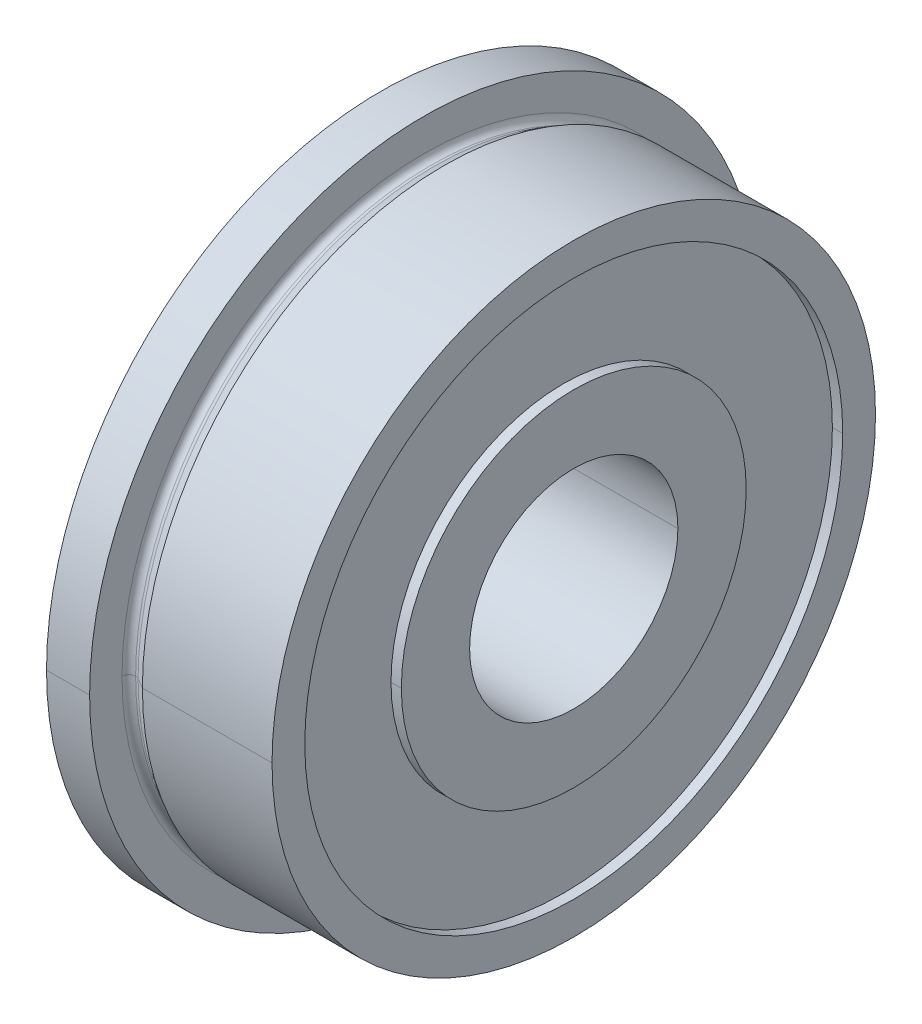
ISO-10303-21;
HEADER;
FILE_DESCRIPTION(('STEP AP214'),'2;1');
FILE_NAME('part.step','',(''),(''),'','','');
FILE_SCHEMA(('AUTOMOTIVE_DESIGN { 1 0 10303 214 1 1 1 1 }'));
ENDSEC;
DATA;
#1=APPLICATION_CONTEXT('core data for automotive mechanical design processes');
#2=APPLICATION_PROTOCOL_DEFINITION('international standard','automotive_design',2000,#1);
#3=PRODUCT_CONTEXT('',#1,'mechanical');
#4=PRODUCT('Part','Part','',(#3));
#5=PRODUCT_RELATED_PRODUCT_CATEGORY('part','',(#4));
#6=PRODUCT_DEFINITION_FORMATION('','',#4);
#7=PRODUCT_DEFINITION_CONTEXT('part definition',#1,'design');
#8=PRODUCT_DEFINITION('design','',#6,#7);
#9=PRODUCT_DEFINITION_SHAPE('','',#8);
#10=(LENGTH_UNIT() NAMED_UNIT(*) SI_UNIT(.MILLI.,.METRE.));
#11=(NAMED_UNIT(*) PLANE_ANGLE_UNIT() SI_UNIT($,.RADIAN.));
#12=(NAMED_UNIT(*) SI_UNIT($,.STERADIAN.) SOLID_ANGLE_UNIT());
#13=UNCERTAINTY_MEASURE_WITH_UNIT(LENGTH_MEASURE(1.E-05),#10,'distance_accuracy_value','');
#14=(GEOMETRIC_REPRESENTATION_CONTEXT(3) GLOBAL_UNCERTAINTY_ASSIGNED_CONTEXT((#13)) GLOBAL_UNIT_ASSIGNED_CONTEXT((#10,
#11,#12)) REPRESENTATION_CONTEXT('',''));
#15=CARTESIAN_POINT('',(0.,0.,0.));
#16=DIRECTION('',(0.,0.,1.));
#17=DIRECTION('',(1.,0.,0.));
#18=AXIS2_PLACEMENT_3D('',#15,#16,#17);
#19=CARTESIAN_POINT('',(0.,0.,0.));
#20=DIRECTION('',(-1.,0.,0.));
#21=DIRECTION('',(0.,0.,1.));
#22=AXIS2_PLACEMENT_3D('',#19,#20,#21);
#23=CYLINDRICAL_SURFACE('',#22,6.35);
#24=DIRECTION('',(-1.,0.,0.));
#25=VECTOR('',#24,1.);
#26=CARTESIAN_POINT('',(0.,0.,-6.35));
#27=LINE('',#26,#25);
#28=CARTESIAN_POINT('',(0.381,0.,-6.35));
#29=VERTEX_POINT('',#28);
#30=CARTESIAN_POINT('',(0.,0.,-6.35));
#31=VERTEX_POINT('',#30);
#32=EDGE_CURVE('E225',#29,#31,#27,.T.);
#33=ORIENTED_EDGE('',*,*,#32,.F.);
#34=CARTESIAN_POINT('',(0.381,0.,0.));
#35=DIRECTION('',(-1.,0.,0.));
#36=DIRECTION('',(0.,0.,1.));
#37=AXIS2_PLACEMENT_3D('',#34,#35,#36);
#38=CIRCLE('',#37,6.35);
#39=CARTESIAN_POINT('',(0.381,0.,6.35));
#40=VERTEX_POINT('',#39);
#41=EDGE_CURVE('E11',#29,#40,#38,.T.);
#42=ORIENTED_EDGE('',*,*,#41,.T.);
#43=DIRECTION('',(-1.,0.,0.));
#44=VECTOR('',#43,1.);
#45=CARTESIAN_POINT('',(0.,0.,6.35));
#46=LINE('',#45,#44);
#47=CARTESIAN_POINT('',(0.,0.,6.35));
#48=VERTEX_POINT('',#47);
#49=EDGE_CURVE('E284',#40,#48,#46,.T.);
#50=ORIENTED_EDGE('',*,*,#49,.T.);
#51=CARTESIAN_POINT('',(0.,0.,0.));
#52=DIRECTION('',(-1.,0.,0.));
#53=DIRECTION('',(0.,0.,1.));
#54=AXIS2_PLACEMENT_3D('',#51,#52,#53);
#55=CIRCLE('',#54,6.35);
#56=EDGE_CURVE('E20',#31,#48,#55,.T.);
#57=ORIENTED_EDGE('',*,*,#56,.F.);
#58=EDGE_LOOP('',(#33,#42,#50,#57));
#59=FACE_BOUND('',#58,.T.);
#60=ADVANCED_FACE('F16',(#59),#23,.T.);
#61=CARTESIAN_POINT('',(0.381,9.906,0.));
#62=DIRECTION('',(1.,0.,0.));
#63=DIRECTION('',(0.,1.,0.));
#64=AXIS2_PLACEMENT_3D('',#61,#62,#63);
#65=PLANE('',#64);
#66=CARTESIAN_POINT('',(0.381,0.,0.));
#67=DIRECTION('',(-1.,0.,0.));
#68=DIRECTION('',(0.,0.,1.));
#69=AXIS2_PLACEMENT_3D('',#66,#67,#68);
#70=CIRCLE('',#69,6.35);
#71=EDGE_CURVE('E195',#40,#29,#70,.T.);
#72=ORIENTED_EDGE('',*,*,#71,.F.);
#73=ORIENTED_EDGE('',*,*,#41,.F.);
#74=EDGE_LOOP('',(#72,#73));
#75=FACE_BOUND('',#74,.T.);
#76=CARTESIAN_POINT('',(0.381,0.,0.));
#77=DIRECTION('',(-1.,0.,0.));
#78=DIRECTION('',(0.,0.,1.));
#79=AXIS2_PLACEMENT_3D('',#76,#77,#78);
#80=CIRCLE('',#79,9.906);
#81=CARTESIAN_POINT('',(0.381,0.,9.906));
#82=VERTEX_POINT('',#81);
#83=CARTESIAN_POINT('',(0.381,0.,-9.906));
#84=VERTEX_POINT('',#83);
#85=EDGE_CURVE('E27',#82,#84,#80,.T.);
#86=ORIENTED_EDGE('',*,*,#85,.T.);
#87=CARTESIAN_POINT('',(0.381,0.,0.));
#88=DIRECTION('',(-1.,0.,0.));
#89=DIRECTION('',(0.,0.,1.));
#90=AXIS2_PLACEMENT_3D('',#87,#88,#89);
#91=CIRCLE('',#90,9.906);
#92=EDGE_CURVE('E384',#84,#82,#91,.T.);
#93=ORIENTED_EDGE('',*,*,#92,.T.);
#94=EDGE_LOOP('',(#86,#93));
#95=FACE_BOUND('',#94,.T.);
#96=ADVANCED_FACE('F407',(#75,#95),#65,.F.);
#97=CARTESIAN_POINT('',(0.,0.,0.));
#98=DIRECTION('',(-1.,0.,0.));
#99=DIRECTION('',(0.,0.,1.));
#100=AXIS2_PLACEMENT_3D('',#97,#98,#99);
#101=CYLINDRICAL_SURFACE('',#100,9.906);
#102=DIRECTION('',(-1.,0.,0.));
#103=VECTOR('',#102,1.);
#104=CARTESIAN_POINT('',(0.,0.,-9.906));
#105=LINE('',#104,#103);
#106=CARTESIAN_POINT('',(0.,0.,-9.906));
#107=VERTEX_POINT('',#106);
#108=EDGE_CURVE('E221',#84,#107,#105,.T.);
#109=ORIENTED_EDGE('',*,*,#108,.F.);
#110=ORIENTED_EDGE('',*,*,#85,.F.);
#111=DIRECTION('',(-1.,0.,0.));
#112=VECTOR('',#111,1.);
#113=CARTESIAN_POINT('',(0.,0.,9.906));
#114=LINE('',#113,#112);
#115=CARTESIAN_POINT('',(0.,0.,9.906));
#116=VERTEX_POINT('',#115);
#117=EDGE_CURVE('E220',#82,#116,#114,.T.);
#118=ORIENTED_EDGE('',*,*,#117,.T.);
#119=CARTESIAN_POINT('',(0.,0.,0.));
#120=DIRECTION('',(-1.,0.,0.));
#121=DIRECTION('',(0.,0.,1.));
#122=AXIS2_PLACEMENT_3D('',#119,#120,#121);
#123=CIRCLE('',#122,9.906);
#124=EDGE_CURVE('E290',#116,#107,#123,.T.);
#125=ORIENTED_EDGE('',*,*,#124,.T.);
#126=EDGE_LOOP('',(#109,#110,#118,#125));
#127=FACE_BOUND('',#126,.T.);
#128=ADVANCED_FACE('F399',(#127),#101,.F.);
#129=CARTESIAN_POINT('',(0.,12.3063,0.));
#130=DIRECTION('',(1.,0.,0.));
#131=DIRECTION('',(0.,1.,0.));
#132=AXIS2_PLACEMENT_3D('',#129,#130,#131);
#133=PLANE('',#132);
#134=ORIENTED_EDGE('',*,*,#124,.F.);
#135=CARTESIAN_POINT('',(0.,0.,0.));
#136=DIRECTION('',(-1.,0.,0.));
#137=DIRECTION('',(0.,0.,1.));
#138=AXIS2_PLACEMENT_3D('',#135,#136,#137);
#139=CIRCLE('',#138,9.906);
#140=EDGE_CURVE('E216',#107,#116,#139,.T.);
#141=ORIENTED_EDGE('',*,*,#140,.F.);
#142=EDGE_LOOP('',(#134,#141));
#143=FACE_BOUND('',#142,.T.);
#144=CARTESIAN_POINT('',(0.,0.,0.));
#145=DIRECTION('',(-1.,0.,0.));
#146=DIRECTION('',(0.,0.,1.));
#147=AXIS2_PLACEMENT_3D('',#144,#145,#146);
#148=CIRCLE('',#147,12.3063);
#149=CARTESIAN_POINT('',(0.,0.,12.3063));
#150=VERTEX_POINT('',#149);
#151=CARTESIAN_POINT('',(0.,0.,-12.3063));
#152=VERTEX_POINT('',#151);
#153=EDGE_CURVE('E238',#150,#152,#148,.T.);
#154=ORIENTED_EDGE('',*,*,#153,.T.);
#155=CARTESIAN_POINT('',(0.,0.,0.));
#156=DIRECTION('',(-1.,0.,0.));
#157=DIRECTION('',(0.,0.,1.));
#158=AXIS2_PLACEMENT_3D('',#155,#156,#157);
#159=CIRCLE('',#158,12.3063);
#160=EDGE_CURVE('E114',#152,#150,#159,.T.);
#161=ORIENTED_EDGE('',*,*,#160,.T.);
#162=EDGE_LOOP('',(#154,#161));
#163=FACE_BOUND('',#162,.T.);
#164=ADVANCED_FACE('F403',(#143,#163),#133,.F.);
#165=CARTESIAN_POINT('',(0.,0.,0.));
#166=DIRECTION('',(-1.,0.,0.));
#167=DIRECTION('',(0.,0.,1.));
#168=AXIS2_PLACEMENT_3D('',#165,#166,#167);
#169=CYLINDRICAL_SURFACE('',#168,12.3063);
#170=DIRECTION('',(-1.,0.,0.));
#171=VECTOR('',#170,1.);
#172=CARTESIAN_POINT('',(0.,0.,-12.3063));
#173=LINE('',#172,#171);
#174=CARTESIAN_POINT('',(1.5875,0.,-12.3063));
#175=VERTEX_POINT('',#174);
#176=EDGE_CURVE('E234',#175,#152,#173,.T.);
#177=ORIENTED_EDGE('',*,*,#176,.F.);
#178=CARTESIAN_POINT('',(1.5875,0.,0.));
#179=DIRECTION('',(-1.,0.,0.));
#180=DIRECTION('',(0.,0.,1.));
#181=AXIS2_PLACEMENT_3D('',#178,#179,#180);
#182=CIRCLE('',#181,12.3063);
#183=CARTESIAN_POINT('',(1.5875,0.,12.3063));
#184=VERTEX_POINT('',#183);
#185=EDGE_CURVE('E302',#175,#184,#182,.T.);
#186=ORIENTED_EDGE('',*,*,#185,.T.);
#187=DIRECTION('',(-1.,0.,0.));
#188=VECTOR('',#187,1.);
#189=CARTESIAN_POINT('',(0.,0.,12.3063));
#190=LINE('',#189,#188);
#191=EDGE_CURVE('E285',#184,#150,#190,.T.);
#192=ORIENTED_EDGE('',*,*,#191,.T.);
#193=ORIENTED_EDGE('',*,*,#160,.F.);
#194=EDGE_LOOP('',(#177,#186,#192,#193));
#195=FACE_BOUND('',#194,.T.);
#196=ADVANCED_FACE('F445',(#195),#169,.T.);
#197=CARTESIAN_POINT('',(1.5875,11.1125,0.));
#198=DIRECTION('',(-1.,0.,0.));
#199=DIRECTION('',(0.,0.,1.));
#200=AXIS2_PLACEMENT_3D('',#197,#198,#199);
#201=PLANE('',#200);
#202=CARTESIAN_POINT('',(1.5875,0.,0.));
#203=DIRECTION('',(-1.,0.,0.));
#204=DIRECTION('',(0.,0.,1.));
#205=AXIS2_PLACEMENT_3D('',#202,#203,#204);
#206=CIRCLE('',#205,11.1125);
#207=CARTESIAN_POINT('',(1.5875,0.,11.1125));
#208=VERTEX_POINT('',#207);
#209=CARTESIAN_POINT('',(1.5875,0.,-11.1125));
#210=VERTEX_POINT('',#209);
#211=EDGE_CURVE('E198',#208,#210,#206,.T.);
#212=ORIENTED_EDGE('',*,*,#211,.T.);
#213=CARTESIAN_POINT('',(1.5875,0.,0.));
#214=DIRECTION('',(-1.,0.,0.));
#215=DIRECTION('',(0.,0.,1.));
#216=AXIS2_PLACEMENT_3D('',#213,#214,#215);
#217=CIRCLE('',#216,11.1125);
#218=EDGE_CURVE('E183',#210,#208,#217,.T.);
#219=ORIENTED_EDGE('',*,*,#218,.T.);
#220=EDGE_LOOP('',(#212,#219));
#221=FACE_BOUND('',#220,.T.);
#222=CARTESIAN_POINT('',(1.5875,0.,0.));
#223=DIRECTION('',(-1.,0.,0.));
#224=DIRECTION('',(0.,0.,1.));
#225=AXIS2_PLACEMENT_3D('',#222,#223,#224);
#226=CIRCLE('',#225,12.3063);
#227=EDGE_CURVE('E239',#184,#175,#226,.T.);
#228=ORIENTED_EDGE('',*,*,#227,.F.);
#229=ORIENTED_EDGE('',*,*,#185,.F.);
#230=EDGE_LOOP('',(#228,#229));
#231=FACE_BOUND('',#230,.T.);
#232=ADVANCED_FACE('F199',(#221,#231),#201,.F.);
#233=CARTESIAN_POINT('',(1.8375,0.,0.));
#234=DIRECTION('',(-1.,0.,0.));
#235=DIRECTION('',(0.,0.,1.));
#236=AXIS2_PLACEMENT_3D('',#233,#234,#235);
#237=TOROIDAL_SURFACE('',#236,11.1125,0.25);
#238=CARTESIAN_POINT('',(1.8375,0.,0.));
#239=DIRECTION('',(-1.,0.,0.));
#240=DIRECTION('',(0.,0.,1.));
#241=AXIS2_PLACEMENT_3D('',#238,#239,#240);
#242=CIRCLE('',#241,10.8625);
#243=CARTESIAN_POINT('',(1.8375,0.,10.8625));
#244=VERTEX_POINT('',#243);
#245=CARTESIAN_POINT('',(1.8375,0.,-10.8625));
#246=VERTEX_POINT('',#245);
#247=EDGE_CURVE('E205',#244,#246,#242,.T.);
#248=ORIENTED_EDGE('',*,*,#247,.F.);
#249=CARTESIAN_POINT('',(1.8375,0.,11.1125));
#250=DIRECTION('',(0.,-1.,0.));
#251=DIRECTION('',(0.,0.,-1.));
#252=AXIS2_PLACEMENT_3D('',#249,#250,#251);
#253=CIRCLE('',#252,0.25);
#254=CARTESIAN_POINT('',(1.9625,0.,10.8959936490539));
#255=VERTEX_POINT('',#254);
#256=EDGE_CURVE('E258',#244,#255,#253,.T.);
#257=ORIENTED_EDGE('',*,*,#256,.T.);
#258=CARTESIAN_POINT('',(1.9625,0.,0.));
#259=DIRECTION('',(-1.,0.,0.));
#260=DIRECTION('',(0.,0.,1.));
#261=AXIS2_PLACEMENT_3D('',#258,#259,#260);
#262=CIRCLE('',#261,10.8959936490539);
#263=CARTESIAN_POINT('',(1.9625,0.,-10.8959936490539));
#264=VERTEX_POINT('',#263);
#265=EDGE_CURVE('E230',#255,#264,#262,.T.);
#266=ORIENTED_EDGE('',*,*,#265,.T.);
#267=CARTESIAN_POINT('',(1.8375,0.,-11.1125));
#268=DIRECTION('',(0.,1.,0.));
#269=DIRECTION('',(0.,0.,1.));
#270=AXIS2_PLACEMENT_3D('',#267,#268,#269);
#271=CIRCLE('',#270,0.25);
#272=EDGE_CURVE('E259',#246,#264,#271,.T.);
#273=ORIENTED_EDGE('',*,*,#272,.F.);
#274=EDGE_LOOP('',(#248,#257,#266,#273));
#275=FACE_BOUND('',#274,.T.);
#276=ADVANCED_FACE('F433',(#275),#237,.F.);
#277=CARTESIAN_POINT('',(2.3375,0.,0.));
#278=DIRECTION('',(1.,0.,0.));
#279=DIRECTION('',(0.,0.,-1.));
#280=AXIS2_PLACEMENT_3D('',#277,#278,#279);
#281=CONICAL_SURFACE('',#280,11.1125,0.523598775598299);
#282=DIRECTION('',(0.866025403784438,0.,0.5));
#283=VECTOR('',#282,1.);
#284=CARTESIAN_POINT('',(2.3375,0.,11.1125));
#285=LINE('',#284,#283);
#286=CARTESIAN_POINT('',(2.3375,0.,11.1125));
#287=VERTEX_POINT('',#286);
#288=EDGE_CURVE('E226',#255,#287,#285,.T.);
#289=ORIENTED_EDGE('',*,*,#288,.F.);
#290=CARTESIAN_POINT('',(1.9625,0.,0.));
#291=DIRECTION('',(-1.,0.,0.));
#292=DIRECTION('',(0.,0.,1.));
#293=AXIS2_PLACEMENT_3D('',#290,#291,#292);
#294=CIRCLE('',#293,10.8959936490539);
#295=EDGE_CURVE('E254',#264,#255,#294,.T.);
#296=ORIENTED_EDGE('',*,*,#295,.F.);
#297=DIRECTION('',(0.866025403784438,0.,-0.5));
#298=VECTOR('',#297,1.);
#299=CARTESIAN_POINT('',(2.3375,0.,-11.1125));
#300=LINE('',#299,#298);
#301=CARTESIAN_POINT('',(2.3375,0.,-11.1125));
#302=VERTEX_POINT('',#301);
#303=EDGE_CURVE('E308',#264,#302,#300,.T.);
#304=ORIENTED_EDGE('',*,*,#303,.T.);
#305=CARTESIAN_POINT('',(2.3375,0.,0.));
#306=DIRECTION('',(-1.,0.,0.));
#307=DIRECTION('',(0.,0.,1.));
#308=AXIS2_PLACEMENT_3D('',#305,#306,#307);
#309=CIRCLE('',#308,11.1125);
#310=EDGE_CURVE('E316',#302,#287,#309,.T.);
#311=ORIENTED_EDGE('',*,*,#310,.T.);
#312=EDGE_LOOP('',(#289,#296,#304,#311));
#313=FACE_BOUND('',#312,.T.);
#314=ADVANCED_FACE('F430',(#313),#281,.T.);
#315=CARTESIAN_POINT('',(0.,0.,0.));
#316=DIRECTION('',(-1.,0.,0.));
#317=DIRECTION('',(0.,0.,1.));
#318=AXIS2_PLACEMENT_3D('',#315,#316,#317);
#319=CYLINDRICAL_SURFACE('',#318,11.1125);
#320=DIRECTION('',(-1.,0.,0.));
#321=VECTOR('',#320,1.);
#322=CARTESIAN_POINT('',(0.,0.,-11.1125));
#323=LINE('',#322,#321);
#324=CARTESIAN_POINT('',(7.112,0.,-11.1125));
#325=VERTEX_POINT('',#324);
#326=EDGE_CURVE('E307',#325,#302,#323,.T.);
#327=ORIENTED_EDGE('',*,*,#326,.F.);
#328=CARTESIAN_POINT('',(7.112,0.,0.));
#329=DIRECTION('',(-1.,0.,0.));
#330=DIRECTION('',(0.,0.,1.));
#331=AXIS2_PLACEMENT_3D('',#328,#329,#330);
#332=CIRCLE('',#331,11.1125);
#333=CARTESIAN_POINT('',(7.112,0.,11.1125));
#334=VERTEX_POINT('',#333);
#335=EDGE_CURVE('E321',#325,#334,#332,.T.);
#336=ORIENTED_EDGE('',*,*,#335,.T.);
#337=DIRECTION('',(-1.,0.,0.));
#338=VECTOR('',#337,1.);
#339=CARTESIAN_POINT('',(0.,0.,11.1125));
#340=LINE('',#339,#338);
#341=EDGE_CURVE('E348',#334,#287,#340,.T.);
#342=ORIENTED_EDGE('',*,*,#341,.T.);
#343=ORIENTED_EDGE('',*,*,#310,.F.);
#344=EDGE_LOOP('',(#327,#336,#342,#343));
#345=FACE_BOUND('',#344,.T.);
#346=ADVANCED_FACE('F428',(#345),#319,.T.);
#347=CARTESIAN_POINT('',(7.112,9.906,0.));
#348=DIRECTION('',(-1.,0.,0.));
#349=DIRECTION('',(0.,0.,1.));
#350=AXIS2_PLACEMENT_3D('',#347,#348,#349);
#351=PLANE('',#350);
#352=CARTESIAN_POINT('',(7.112,0.,0.));
#353=DIRECTION('',(-1.,0.,0.));
#354=DIRECTION('',(0.,0.,1.));
#355=AXIS2_PLACEMENT_3D('',#352,#353,#354);
#356=CIRCLE('',#355,9.906);
#357=CARTESIAN_POINT('',(7.112,0.,9.906));
#358=VERTEX_POINT('',#357);
#359=CARTESIAN_POINT('',(7.112,0.,-9.906));
#360=VERTEX_POINT('',#359);
#361=EDGE_CURVE('E329',#358,#360,#356,.T.);
#362=ORIENTED_EDGE('',*,*,#361,.T.);
#363=CARTESIAN_POINT('',(7.112,0.,0.));
#364=DIRECTION('',(-1.,0.,0.));
#365=DIRECTION('',(0.,0.,1.));
#366=AXIS2_PLACEMENT_3D('',#363,#364,#365);
#367=CIRCLE('',#366,9.906);
#368=EDGE_CURVE('E299',#360,#358,#367,.T.);
#369=ORIENTED_EDGE('',*,*,#368,.T.);
#370=EDGE_LOOP('',(#362,#369));
#371=FACE_BOUND('',#370,.T.);
#372=CARTESIAN_POINT('',(7.112,0.,0.));
#373=DIRECTION('',(-1.,0.,0.));
#374=DIRECTION('',(0.,0.,1.));
#375=AXIS2_PLACEMENT_3D('',#372,#373,#374);
#376=CIRCLE('',#375,11.1125);
#377=EDGE_CURVE('E303',#334,#325,#376,.T.);
#378=ORIENTED_EDGE('',*,*,#377,.F.);
#379=ORIENTED_EDGE('',*,*,#335,.F.);
#380=EDGE_LOOP('',(#378,#379));
#381=FACE_BOUND('',#380,.T.);
#382=ADVANCED_FACE('F424',(#371,#381),#351,.F.);
#383=CARTESIAN_POINT('',(0.,0.,0.));
#384=DIRECTION('',(-1.,0.,0.));
#385=DIRECTION('',(0.,0.,1.));
#386=AXIS2_PLACEMENT_3D('',#383,#384,#385);
#387=CYLINDRICAL_SURFACE('',#386,9.906);
#388=DIRECTION('',(-1.,0.,0.));
#389=VECTOR('',#388,1.);
#390=CARTESIAN_POINT('',(0.,0.,-9.906));
#391=LINE('',#390,#389);
#392=CARTESIAN_POINT('',(6.731,0.,-9.906));
#393=VERTEX_POINT('',#392);
#394=EDGE_CURVE('E253',#360,#393,#391,.T.);
#395=ORIENTED_EDGE('',*,*,#394,.F.);
#396=ORIENTED_EDGE('',*,*,#361,.F.);
#397=DIRECTION('',(-1.,0.,0.));
#398=VECTOR('',#397,1.);
#399=CARTESIAN_POINT('',(0.,0.,9.906));
#400=LINE('',#399,#398);
#401=CARTESIAN_POINT('',(6.731,0.,9.906));
#402=VERTEX_POINT('',#401);
#403=EDGE_CURVE('E252',#358,#402,#400,.T.);
#404=ORIENTED_EDGE('',*,*,#403,.T.);
#405=CARTESIAN_POINT('',(6.731,0.,0.));
#406=DIRECTION('',(-1.,0.,0.));
#407=DIRECTION('',(0.,0.,1.));
#408=AXIS2_PLACEMENT_3D('',#405,#406,#407);
#409=CIRCLE('',#408,9.906);
#410=EDGE_CURVE('E243',#402,#393,#409,.T.);
#411=ORIENTED_EDGE('',*,*,#410,.T.);
#412=EDGE_LOOP('',(#395,#396,#404,#411));
#413=FACE_BOUND('',#412,.T.);
#414=ADVANCED_FACE('F427',(#413),#387,.F.);
#415=CARTESIAN_POINT('',(6.731,9.906,0.));
#416=DIRECTION('',(-1.,0.,0.));
#417=DIRECTION('',(0.,0.,1.));
#418=AXIS2_PLACEMENT_3D('',#415,#416,#417);
#419=PLANE('',#418);
#420=CARTESIAN_POINT('',(6.731,0.,0.));
#421=DIRECTION('',(-1.,0.,0.));
#422=DIRECTION('',(0.,0.,1.));
#423=AXIS2_PLACEMENT_3D('',#420,#421,#422);
#424=CIRCLE('',#423,6.35);
#425=CARTESIAN_POINT('',(6.731,0.,6.35));
#426=VERTEX_POINT('',#425);
#427=CARTESIAN_POINT('',(6.731,0.,-6.35));
#428=VERTEX_POINT('',#427);
#429=EDGE_CURVE('E349',#426,#428,#424,.T.);
#430=ORIENTED_EDGE('',*,*,#429,.T.);
#431=CARTESIAN_POINT('',(6.731,0.,0.));
#432=DIRECTION('',(-1.,0.,0.));
#433=DIRECTION('',(0.,0.,1.));
#434=AXIS2_PLACEMENT_3D('',#431,#432,#433);
#435=CIRCLE('',#434,6.35);
#436=EDGE_CURVE('E240',#428,#426,#435,.T.);
#437=ORIENTED_EDGE('',*,*,#436,.T.);
#438=EDGE_LOOP('',(#430,#437));
#439=FACE_BOUND('',#438,.T.);
#440=ORIENTED_EDGE('',*,*,#410,.F.);
#441=CARTESIAN_POINT('',(6.731,0.,0.));
#442=DIRECTION('',(-1.,0.,0.));
#443=DIRECTION('',(0.,0.,1.));
#444=AXIS2_PLACEMENT_3D('',#441,#442,#443);
#445=CIRCLE('',#444,9.906);
#446=EDGE_CURVE('E248',#393,#402,#445,.T.);
#447=ORIENTED_EDGE('',*,*,#446,.F.);
#448=EDGE_LOOP('',(#440,#447));
#449=FACE_BOUND('',#448,.T.);
#450=ADVANCED_FACE('F458',(#439,#449),#419,.F.);
#451=CARTESIAN_POINT('',(0.,0.,0.));
#452=DIRECTION('',(-1.,0.,0.));
#453=DIRECTION('',(0.,0.,1.));
#454=AXIS2_PLACEMENT_3D('',#451,#452,#453);
#455=CYLINDRICAL_SURFACE('',#454,6.35);
#456=DIRECTION('',(-1.,0.,0.));
#457=VECTOR('',#456,1.);
#458=CARTESIAN_POINT('',(0.,0.,-6.35));
#459=LINE('',#458,#457);
#460=CARTESIAN_POINT('',(7.112,0.,-6.35));
#461=VERTEX_POINT('',#460);
#462=EDGE_CURVE('E353',#461,#428,#459,.T.);
#463=ORIENTED_EDGE('',*,*,#462,.F.);
#464=CARTESIAN_POINT('',(7.112,0.,0.));
#465=DIRECTION('',(-1.,0.,0.));
#466=DIRECTION('',(0.,0.,1.));
#467=AXIS2_PLACEMENT_3D('',#464,#465,#466);
#468=CIRCLE('',#467,6.35);
#469=CARTESIAN_POINT('',(7.112,0.,6.35));
#470=VERTEX_POINT('',#469);
#471=EDGE_CURVE('E244',#461,#470,#468,.T.);
#472=ORIENTED_EDGE('',*,*,#471,.T.);
#473=DIRECTION('',(-1.,0.,0.));
#474=VECTOR('',#473,1.);
#475=CARTESIAN_POINT('',(0.,0.,6.35));
#476=LINE('',#475,#474);
#477=EDGE_CURVE('E314',#470,#426,#476,.T.);
#478=ORIENTED_EDGE('',*,*,#477,.T.);
#479=ORIENTED_EDGE('',*,*,#436,.F.);
#480=EDGE_LOOP('',(#463,#472,#478,#479));
#481=FACE_BOUND('',#480,.T.);
#482=ADVANCED_FACE('F460',(#481),#455,.T.);
#483=CARTESIAN_POINT('',(7.112,3.8354,0.));
#484=DIRECTION('',(-1.,0.,0.));
#485=DIRECTION('',(0.,0.,1.));
#486=AXIS2_PLACEMENT_3D('',#483,#484,#485);
#487=PLANE('',#486);
#488=CARTESIAN_POINT('',(7.112,0.,0.));
#489=DIRECTION('',(-1.,0.,0.));
#490=DIRECTION('',(0.,0.,1.));
#491=AXIS2_PLACEMENT_3D('',#488,#489,#490);
#492=CIRCLE('',#491,3.8354);
#493=CARTESIAN_POINT('',(7.112,0.,3.8354));
#494=VERTEX_POINT('',#493);
#495=CARTESIAN_POINT('',(7.112,0.,-3.8354));
#496=VERTEX_POINT('',#495);
#497=EDGE_CURVE('E233',#494,#496,#492,.T.);
#498=ORIENTED_EDGE('',*,*,#497,.T.);
#499=CARTESIAN_POINT('',(7.112,0.,0.));
#500=DIRECTION('',(-1.,0.,0.));
#501=DIRECTION('',(0.,0.,1.));
#502=AXIS2_PLACEMENT_3D('',#499,#500,#501);
#503=CIRCLE('',#502,3.8354);
#504=EDGE_CURVE('E295',#496,#494,#503,.T.);
#505=ORIENTED_EDGE('',*,*,#504,.T.);
#506=EDGE_LOOP('',(#498,#505));
#507=FACE_BOUND('',#506,.T.);
#508=CARTESIAN_POINT('',(7.112,0.,0.));
#509=DIRECTION('',(-1.,0.,0.));
#510=DIRECTION('',(0.,0.,1.));
#511=AXIS2_PLACEMENT_3D('',#508,#509,#510);
#512=CIRCLE('',#511,6.35);
#513=EDGE_CURVE('E357',#470,#461,#512,.T.);
#514=ORIENTED_EDGE('',*,*,#513,.F.);
#515=ORIENTED_EDGE('',*,*,#471,.F.);
#516=EDGE_LOOP('',(#514,#515));
#517=FACE_BOUND('',#516,.T.);
#518=ADVANCED_FACE('F471',(#507,#517),#487,.F.);
#519=CARTESIAN_POINT('',(0.,0.,0.));
#520=DIRECTION('',(-1.,0.,0.));
#521=DIRECTION('',(0.,0.,1.));
#522=AXIS2_PLACEMENT_3D('',#519,#520,#521);
#523=CYLINDRICAL_SURFACE('',#522,3.8354);
#524=DIRECTION('',(-1.,0.,0.));
#525=VECTOR('',#524,1.);
#526=CARTESIAN_POINT('',(0.,0.,-3.8354));
#527=LINE('',#526,#525);
#528=CARTESIAN_POINT('',(0.,0.,-3.8354));
#529=VERTEX_POINT('',#528);
#530=EDGE_CURVE('E291',#496,#529,#527,.T.);
#531=ORIENTED_EDGE('',*,*,#530,.F.);
#532=ORIENTED_EDGE('',*,*,#497,.F.);
#533=DIRECTION('',(-1.,0.,0.));
#534=VECTOR('',#533,1.);
#535=CARTESIAN_POINT('',(0.,0.,3.8354));
#536=LINE('',#535,#534);
#537=CARTESIAN_POINT('',(0.,0.,3.8354));
#538=VERTEX_POINT('',#537);
#539=EDGE_CURVE('E260',#494,#538,#536,.T.);
#540=ORIENTED_EDGE('',*,*,#539,.T.);
#541=CARTESIAN_POINT('',(0.,0.,0.));
#542=DIRECTION('',(-1.,0.,0.));
#543=DIRECTION('',(0.,0.,1.));
#544=AXIS2_PLACEMENT_3D('',#541,#542,#543);
#545=CIRCLE('',#544,3.8354);
#546=EDGE_CURVE('E41',#538,#529,#545,.T.);
#547=ORIENTED_EDGE('',*,*,#546,.T.);
#548=EDGE_LOOP('',(#531,#532,#540,#547));
#549=FACE_BOUND('',#548,.T.);
#550=ADVANCED_FACE('F444',(#549),#523,.F.);
#551=CARTESIAN_POINT('',(0.,6.35,0.));
#552=DIRECTION('',(1.,0.,0.));
#553=DIRECTION('',(0.,1.,0.));
#554=AXIS2_PLACEMENT_3D('',#551,#552,#553);
#555=PLANE('',#554);
#556=ORIENTED_EDGE('',*,*,#546,.F.);
#557=CARTESIAN_POINT('',(0.,0.,0.));
#558=DIRECTION('',(-1.,0.,0.));
#559=DIRECTION('',(0.,0.,1.));
#560=AXIS2_PLACEMENT_3D('',#557,#558,#559);
#561=CIRCLE('',#560,3.8354);
#562=EDGE_CURVE('E262',#529,#538,#561,.T.);
#563=ORIENTED_EDGE('',*,*,#562,.F.);
#564=EDGE_LOOP('',(#556,#563));
#565=FACE_BOUND('',#564,.T.);
#566=CARTESIAN_POINT('',(0.,0.,0.));
#567=DIRECTION('',(-1.,0.,0.));
#568=DIRECTION('',(0.,0.,1.));
#569=AXIS2_PLACEMENT_3D('',#566,#567,#568);
#570=CIRCLE('',#569,6.35);
#571=EDGE_CURVE('E280',#48,#31,#570,.T.);
#572=ORIENTED_EDGE('',*,*,#571,.T.);
#573=ORIENTED_EDGE('',*,*,#56,.T.);
#574=EDGE_LOOP('',(#572,#573));
#575=FACE_BOUND('',#574,.T.);
#576=ADVANCED_FACE('F440',(#565,#575),#555,.F.);
#577=CARTESIAN_POINT('',(0.,0.,0.));
#578=DIRECTION('',(-1.,0.,0.));
#579=DIRECTION('',(0.,0.,1.));
#580=AXIS2_PLACEMENT_3D('',#577,#578,#579);
#581=CYLINDRICAL_SURFACE('',#580,3.8354);
#582=ORIENTED_EDGE('',*,*,#504,.F.);
#583=ORIENTED_EDGE('',*,*,#530,.T.);
#584=ORIENTED_EDGE('',*,*,#562,.T.);
#585=ORIENTED_EDGE('',*,*,#539,.F.);
#586=EDGE_LOOP('',(#582,#583,#584,#585));
#587=FACE_BOUND('',#586,.T.);
#588=ADVANCED_FACE('F443',(#587),#581,.F.);
#589=CARTESIAN_POINT('',(0.,0.,0.));
#590=DIRECTION('',(-1.,0.,0.));
#591=DIRECTION('',(0.,0.,1.));
#592=AXIS2_PLACEMENT_3D('',#589,#590,#591);
#593=CYLINDRICAL_SURFACE('',#592,6.35);
#594=ORIENTED_EDGE('',*,*,#513,.T.);
#595=ORIENTED_EDGE('',*,*,#462,.T.);
#596=ORIENTED_EDGE('',*,*,#429,.F.);
#597=ORIENTED_EDGE('',*,*,#477,.F.);
#598=EDGE_LOOP('',(#594,#595,#596,#597));
#599=FACE_BOUND('',#598,.T.);
#600=ADVANCED_FACE('F422',(#599),#593,.T.);
#601=CARTESIAN_POINT('',(0.,0.,0.));
#602=DIRECTION('',(-1.,0.,0.));
#603=DIRECTION('',(0.,0.,1.));
#604=AXIS2_PLACEMENT_3D('',#601,#602,#603);
#605=CYLINDRICAL_SURFACE('',#604,9.906);
#606=ORIENTED_EDGE('',*,*,#368,.F.);
#607=ORIENTED_EDGE('',*,*,#394,.T.);
#608=ORIENTED_EDGE('',*,*,#446,.T.);
#609=ORIENTED_EDGE('',*,*,#403,.F.);
#610=EDGE_LOOP('',(#606,#607,#608,#609));
#611=FACE_BOUND('',#610,.T.);
#612=ADVANCED_FACE('F453',(#611),#605,.F.);
#613=CARTESIAN_POINT('',(0.,0.,0.));
#614=DIRECTION('',(-1.,0.,0.));
#615=DIRECTION('',(0.,0.,1.));
#616=AXIS2_PLACEMENT_3D('',#613,#614,#615);
#617=CYLINDRICAL_SURFACE('',#616,11.1125);
#618=ORIENTED_EDGE('',*,*,#377,.T.);
#619=ORIENTED_EDGE('',*,*,#326,.T.);
#620=CARTESIAN_POINT('',(2.3375,0.,0.));
#621=DIRECTION('',(-1.,0.,0.));
#622=DIRECTION('',(0.,0.,1.));
#623=AXIS2_PLACEMENT_3D('',#620,#621,#622);
#624=CIRCLE('',#623,11.1125);
#625=EDGE_CURVE('E215',#287,#302,#624,.T.);
#626=ORIENTED_EDGE('',*,*,#625,.F.);
#627=ORIENTED_EDGE('',*,*,#341,.F.);
#628=EDGE_LOOP('',(#618,#619,#626,#627));
#629=FACE_BOUND('',#628,.T.);
#630=ADVANCED_FACE('F456',(#629),#617,.T.);
#631=CARTESIAN_POINT('',(2.3375,0.,0.));
#632=DIRECTION('',(1.,0.,0.));
#633=DIRECTION('',(0.,0.,-1.));
#634=AXIS2_PLACEMENT_3D('',#631,#632,#633);
#635=CONICAL_SURFACE('',#634,11.1125,0.523598775598299);
#636=ORIENTED_EDGE('',*,*,#265,.F.);
#637=ORIENTED_EDGE('',*,*,#288,.T.);
#638=ORIENTED_EDGE('',*,*,#625,.T.);
#639=ORIENTED_EDGE('',*,*,#303,.F.);
#640=EDGE_LOOP('',(#636,#637,#638,#639));
#641=FACE_BOUND('',#640,.T.);
#642=ADVANCED_FACE('F438',(#641),#635,.T.);
#643=CARTESIAN_POINT('',(1.8375,0.,0.));
#644=DIRECTION('',(-1.,0.,0.));
#645=DIRECTION('',(0.,0.,1.));
#646=AXIS2_PLACEMENT_3D('',#643,#644,#645);
#647=TOROIDAL_SURFACE('',#646,11.1125,0.25);
#648=CARTESIAN_POINT('',(1.8375,0.,0.));
#649=DIRECTION('',(-1.,0.,0.));
#650=DIRECTION('',(0.,0.,1.));
#651=AXIS2_PLACEMENT_3D('',#648,#649,#650);
#652=CIRCLE('',#651,10.8625);
#653=EDGE_CURVE('E196',#246,#244,#652,.T.);
#654=ORIENTED_EDGE('',*,*,#653,.F.);
#655=ORIENTED_EDGE('',*,*,#272,.T.);
#656=ORIENTED_EDGE('',*,*,#295,.T.);
#657=ORIENTED_EDGE('',*,*,#256,.F.);
#658=EDGE_LOOP('',(#654,#655,#656,#657));
#659=FACE_BOUND('',#658,.T.);
#660=ADVANCED_FACE('F434',(#659),#647,.F.);
#661=CARTESIAN_POINT('',(0.,0.,0.));
#662=DIRECTION('',(-1.,0.,0.));
#663=DIRECTION('',(0.,0.,1.));
#664=AXIS2_PLACEMENT_3D('',#661,#662,#663);
#665=CYLINDRICAL_SURFACE('',#664,12.3063);
#666=ORIENTED_EDGE('',*,*,#227,.T.);
#667=ORIENTED_EDGE('',*,*,#176,.T.);
#668=ORIENTED_EDGE('',*,*,#153,.F.);
#669=ORIENTED_EDGE('',*,*,#191,.F.);
#670=EDGE_LOOP('',(#666,#667,#668,#669));
#671=FACE_BOUND('',#670,.T.);
#672=ADVANCED_FACE('F437',(#671),#665,.T.);
#673=CARTESIAN_POINT('',(0.,0.,0.));
#674=DIRECTION('',(-1.,0.,0.));
#675=DIRECTION('',(0.,0.,1.));
#676=AXIS2_PLACEMENT_3D('',#673,#674,#675);
#677=CYLINDRICAL_SURFACE('',#676,9.906);
#678=ORIENTED_EDGE('',*,*,#92,.F.);
#679=ORIENTED_EDGE('',*,*,#108,.T.);
#680=ORIENTED_EDGE('',*,*,#140,.T.);
#681=ORIENTED_EDGE('',*,*,#117,.F.);
#682=EDGE_LOOP('',(#678,#679,#680,#681));
#683=FACE_BOUND('',#682,.T.);
#684=ADVANCED_FACE('F405',(#683),#677,.F.);
#685=CARTESIAN_POINT('',(0.,0.,0.));
#686=DIRECTION('',(-1.,0.,0.));
#687=DIRECTION('',(0.,0.,1.));
#688=AXIS2_PLACEMENT_3D('',#685,#686,#687);
#689=CYLINDRICAL_SURFACE('',#688,6.35);
#690=ORIENTED_EDGE('',*,*,#71,.T.);
#691=ORIENTED_EDGE('',*,*,#32,.T.);
#692=ORIENTED_EDGE('',*,*,#571,.F.);
#693=ORIENTED_EDGE('',*,*,#49,.F.);
#694=EDGE_LOOP('',(#690,#691,#692,#693));
#695=FACE_BOUND('',#694,.T.);
#696=ADVANCED_FACE('F450',(#695),#689,.T.);
#697=CARTESIAN_POINT('',(1.8375,0.,0.));
#698=DIRECTION('',(-1.,0.,0.));
#699=DIRECTION('',(0.,0.,1.));
#700=AXIS2_PLACEMENT_3D('',#697,#698,#699);
#701=TOROIDAL_SURFACE('',#700,11.1125,0.25);
#702=CARTESIAN_POINT('',(1.8375,0.,-11.1125));
#703=DIRECTION('',(0.,1.,0.));
#704=DIRECTION('',(0.,0.,1.));
#705=AXIS2_PLACEMENT_3D('',#702,#703,#704);
#706=CIRCLE('',#705,0.25);
#707=EDGE_CURVE('E188',#210,#246,#706,.T.);
#708=ORIENTED_EDGE('',*,*,#707,.T.);
#709=ORIENTED_EDGE('',*,*,#653,.T.);
#710=CARTESIAN_POINT('',(1.8375,0.,11.1125));
#711=DIRECTION('',(0.,-1.,0.));
#712=DIRECTION('',(0.,0.,-1.));
#713=AXIS2_PLACEMENT_3D('',#710,#711,#712);
#714=CIRCLE('',#713,0.25);
#715=EDGE_CURVE('E191',#208,#244,#714,.T.);
#716=ORIENTED_EDGE('',*,*,#715,.F.);
#717=ORIENTED_EDGE('',*,*,#218,.F.);
#718=EDGE_LOOP('',(#708,#709,#716,#717));
#719=FACE_BOUND('',#718,.T.);
#720=ADVANCED_FACE('F185',(#719),#701,.F.);
#721=CARTESIAN_POINT('',(1.8375,0.,0.));
#722=DIRECTION('',(-1.,0.,0.));
#723=DIRECTION('',(0.,0.,1.));
#724=AXIS2_PLACEMENT_3D('',#721,#722,#723);
#725=TOROIDAL_SURFACE('',#724,11.1125,0.25);
#726=ORIENTED_EDGE('',*,*,#715,.T.);
#727=ORIENTED_EDGE('',*,*,#247,.T.);
#728=ORIENTED_EDGE('',*,*,#707,.F.);
#729=ORIENTED_EDGE('',*,*,#211,.F.);
#730=EDGE_LOOP('',(#726,#727,#728,#729));
#731=FACE_BOUND('',#730,.T.);
#732=ADVANCED_FACE('F18',(#731),#725,.F.);
#733=CLOSED_SHELL('',(#60,#96,#128,#164,#196,#232,#276,#314,#346,#382,#414,#450,#482,#518,#550,
#576,#588,#600,#612,#630,#642,#660,#672,#684,#696,#720,#732));
#734=MANIFOLD_SOLID_BREP('B1',#733);
#735=ADVANCED_BREP_SHAPE_REPRESENTATION('',(#18,#734),#14);
#736=SHAPE_DEFINITION_REPRESENTATION(#9,#735);
ENDSEC;
END-ISO-10303-21;
